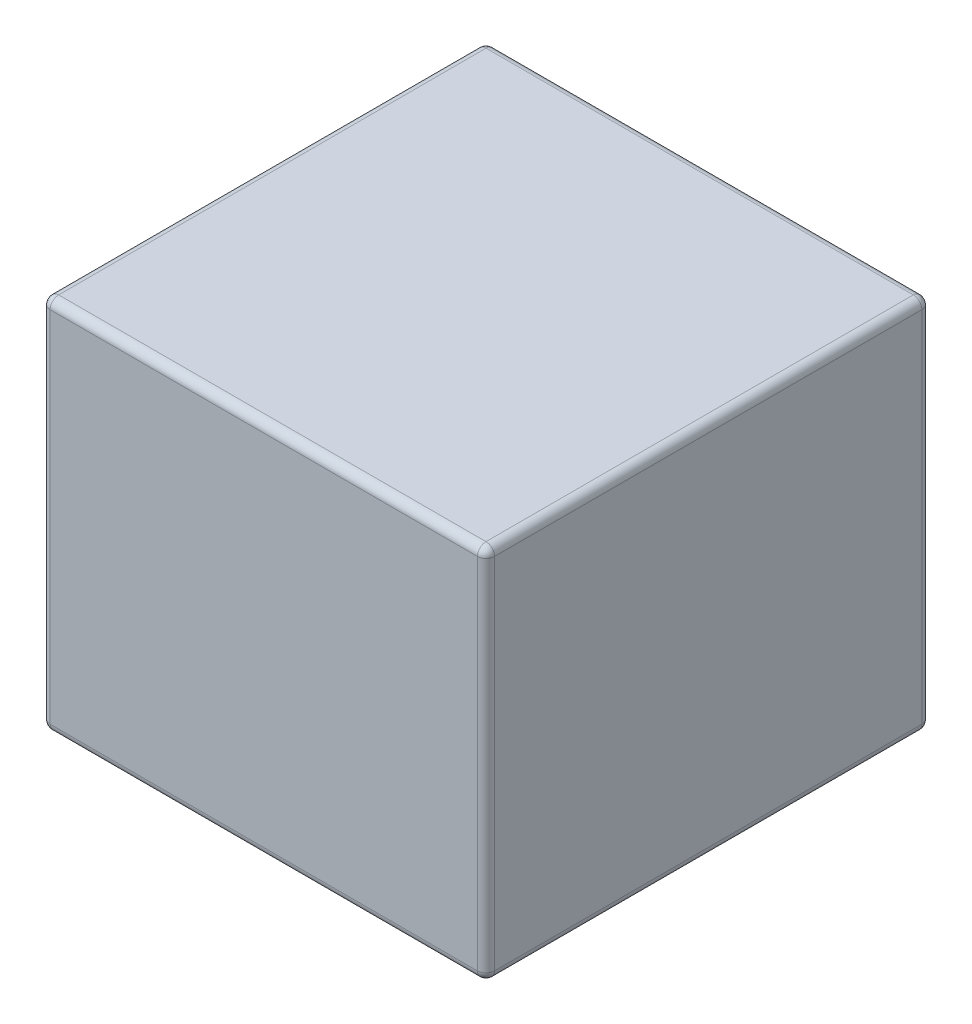
ISO-10303-21;
HEADER;
FILE_DESCRIPTION(('STEP AP214'),'2;1');
FILE_NAME('part.step','',(''),(''),'','','');
FILE_SCHEMA(('AUTOMOTIVE_DESIGN { 1 0 10303 214 1 1 1 1 }'));
ENDSEC;
DATA;
#1=APPLICATION_CONTEXT('core data for automotive mechanical design processes');
#2=APPLICATION_PROTOCOL_DEFINITION('international standard','automotive_design',2000,#1);
#3=PRODUCT_CONTEXT('',#1,'mechanical');
#4=PRODUCT('Part','Part','',(#3));
#5=PRODUCT_RELATED_PRODUCT_CATEGORY('part','',(#4));
#6=PRODUCT_DEFINITION_FORMATION('','',#4);
#7=PRODUCT_DEFINITION_CONTEXT('part definition',#1,'design');
#8=PRODUCT_DEFINITION('design','',#6,#7);
#9=PRODUCT_DEFINITION_SHAPE('','',#8);
#10=(LENGTH_UNIT() NAMED_UNIT(*) SI_UNIT(.MILLI.,.METRE.));
#11=(NAMED_UNIT(*) PLANE_ANGLE_UNIT() SI_UNIT($,.RADIAN.));
#12=(NAMED_UNIT(*) SI_UNIT($,.STERADIAN.) SOLID_ANGLE_UNIT());
#13=UNCERTAINTY_MEASURE_WITH_UNIT(LENGTH_MEASURE(1.E-05),#10,'distance_accuracy_value','');
#14=(GEOMETRIC_REPRESENTATION_CONTEXT(3) GLOBAL_UNCERTAINTY_ASSIGNED_CONTEXT((#13)) GLOBAL_UNIT_ASSIGNED_CONTEXT((#10,
#11,#12)) REPRESENTATION_CONTEXT('',''));
#15=CARTESIAN_POINT('',(0.,0.,0.));
#16=DIRECTION('',(0.,0.,1.));
#17=DIRECTION('',(1.,0.,0.));
#18=AXIS2_PLACEMENT_3D('',#15,#16,#17);
#19=CARTESIAN_POINT('',(165.1,279.4,165.1));
#20=DIRECTION('',(-1.,0.,0.));
#21=DIRECTION('',(0.,0.,1.));
#22=AXIS2_PLACEMENT_3D('',#19,#20,#21);
#23=PLANE('',#22);
#24=DIRECTION('',(0.,0.,-1.));
#25=VECTOR('',#24,1.);
#26=CARTESIAN_POINT('',(165.1,273.05,165.1));
#27=LINE('',#26,#25);
#28=CARTESIAN_POINT('',(165.1,273.05,-158.75));
#29=VERTEX_POINT('',#28);
#30=CARTESIAN_POINT('',(165.1,273.05,158.75));
#31=VERTEX_POINT('',#30);
#32=EDGE_CURVE('E153',#29,#31,#27,.F.);
#33=ORIENTED_EDGE('',*,*,#32,.T.);
#34=DIRECTION('',(0.,-1.,0.));
#35=VECTOR('',#34,1.);
#36=CARTESIAN_POINT('',(165.1,279.4,158.75));
#37=LINE('',#36,#35);
#38=CARTESIAN_POINT('',(165.1,6.35000000000002,158.75));
#39=VERTEX_POINT('',#38);
#40=EDGE_CURVE('E156',#31,#39,#37,.T.);
#41=ORIENTED_EDGE('',*,*,#40,.T.);
#42=DIRECTION('',(0.,0.,-1.));
#43=VECTOR('',#42,1.);
#44=CARTESIAN_POINT('',(165.1,6.35000000000002,-165.1));
#45=LINE('',#44,#43);
#46=CARTESIAN_POINT('',(165.1,6.35000000000002,-158.75));
#47=VERTEX_POINT('',#46);
#48=EDGE_CURVE('E130',#39,#47,#45,.T.);
#49=ORIENTED_EDGE('',*,*,#48,.T.);
#50=DIRECTION('',(0.,-1.,0.));
#51=VECTOR('',#50,1.);
#52=CARTESIAN_POINT('',(165.1,279.4,-158.75));
#53=LINE('',#52,#51);
#54=EDGE_CURVE('E148',#47,#29,#53,.F.);
#55=ORIENTED_EDGE('',*,*,#54,.T.);
#56=EDGE_LOOP('',(#33,#41,#49,#55));
#57=FACE_BOUND('',#56,.T.);
#58=ADVANCED_FACE('F33',(#57),#23,.F.);
#59=CARTESIAN_POINT('',(-165.1,279.4,-165.1));
#60=DIRECTION('',(0.,0.,1.));
#61=DIRECTION('',(1.,0.,0.));
#62=AXIS2_PLACEMENT_3D('',#59,#60,#61);
#63=PLANE('',#62);
#64=DIRECTION('',(-1.,0.,0.));
#65=VECTOR('',#64,1.);
#66=CARTESIAN_POINT('',(-165.1,6.35000000000002,-165.1));
#67=LINE('',#66,#65);
#68=CARTESIAN_POINT('',(158.75,6.35000000000002,-165.1));
#69=VERTEX_POINT('',#68);
#70=CARTESIAN_POINT('',(-158.75,6.35000000000002,-165.1));
#71=VERTEX_POINT('',#70);
#72=EDGE_CURVE('E173',#69,#71,#67,.T.);
#73=ORIENTED_EDGE('',*,*,#72,.T.);
#74=DIRECTION('',(0.,-1.,0.));
#75=VECTOR('',#74,1.);
#76=CARTESIAN_POINT('',(-158.75,279.4,-165.1));
#77=LINE('',#76,#75);
#78=CARTESIAN_POINT('',(-158.75,273.05,-165.1));
#79=VERTEX_POINT('',#78);
#80=EDGE_CURVE('E176',#71,#79,#77,.F.);
#81=ORIENTED_EDGE('',*,*,#80,.T.);
#82=DIRECTION('',(-1.,0.,0.));
#83=VECTOR('',#82,1.);
#84=CARTESIAN_POINT('',(-165.1,273.05,-165.1));
#85=LINE('',#84,#83);
#86=CARTESIAN_POINT('',(158.75,273.05,-165.1));
#87=VERTEX_POINT('',#86);
#88=EDGE_CURVE('E171',#79,#87,#85,.F.);
#89=ORIENTED_EDGE('',*,*,#88,.T.);
#90=DIRECTION('',(0.,-1.,0.));
#91=VECTOR('',#90,1.);
#92=CARTESIAN_POINT('',(158.75,279.4,-165.1));
#93=LINE('',#92,#91);
#94=EDGE_CURVE('E169',#87,#69,#93,.T.);
#95=ORIENTED_EDGE('',*,*,#94,.T.);
#96=EDGE_LOOP('',(#73,#81,#89,#95));
#97=FACE_BOUND('',#96,.T.);
#98=ADVANCED_FACE('F323',(#97),#63,.F.);
#99=CARTESIAN_POINT('',(-165.1,279.4,165.1));
#100=DIRECTION('',(1.,0.,0.));
#101=DIRECTION('',(0.,0.,-1.));
#102=AXIS2_PLACEMENT_3D('',#99,#100,#101);
#103=PLANE('',#102);
#104=DIRECTION('',(0.,0.,1.));
#105=VECTOR('',#104,1.);
#106=CARTESIAN_POINT('',(-165.1,6.35000000000002,165.1));
#107=LINE('',#106,#105);
#108=CARTESIAN_POINT('',(-165.1,6.35000000000002,-158.75));
#109=VERTEX_POINT('',#108);
#110=CARTESIAN_POINT('',(-165.1,6.35000000000002,158.75));
#111=VERTEX_POINT('',#110);
#112=EDGE_CURVE('E182',#109,#111,#107,.T.);
#113=ORIENTED_EDGE('',*,*,#112,.T.);
#114=DIRECTION('',(0.,-1.,0.));
#115=VECTOR('',#114,1.);
#116=CARTESIAN_POINT('',(-165.1,279.4,158.75));
#117=LINE('',#116,#115);
#118=CARTESIAN_POINT('',(-165.1,273.05,158.75));
#119=VERTEX_POINT('',#118);
#120=EDGE_CURVE('E185',#111,#119,#117,.F.);
#121=ORIENTED_EDGE('',*,*,#120,.T.);
#122=DIRECTION('',(0.,0.,1.));
#123=VECTOR('',#122,1.);
#124=CARTESIAN_POINT('',(-165.1,273.05,165.1));
#125=LINE('',#124,#123);
#126=CARTESIAN_POINT('',(-165.1,273.05,-158.75));
#127=VERTEX_POINT('',#126);
#128=EDGE_CURVE('E180',#119,#127,#125,.F.);
#129=ORIENTED_EDGE('',*,*,#128,.T.);
#130=DIRECTION('',(0.,-1.,0.));
#131=VECTOR('',#130,1.);
#132=CARTESIAN_POINT('',(-165.1,279.4,-158.75));
#133=LINE('',#132,#131);
#134=EDGE_CURVE('E178',#127,#109,#133,.T.);
#135=ORIENTED_EDGE('',*,*,#134,.T.);
#136=EDGE_LOOP('',(#113,#121,#129,#135));
#137=FACE_BOUND('',#136,.T.);
#138=ADVANCED_FACE('F293',(#137),#103,.F.);
#139=CARTESIAN_POINT('',(-165.1,279.4,165.1));
#140=DIRECTION('',(0.,0.,-1.));
#141=DIRECTION('',(-1.,0.,0.));
#142=AXIS2_PLACEMENT_3D('',#139,#140,#141);
#143=PLANE('',#142);
#144=DIRECTION('',(0.,-1.,0.));
#145=VECTOR('',#144,1.);
#146=CARTESIAN_POINT('',(-158.75,279.4,165.1));
#147=LINE('',#146,#145);
#148=CARTESIAN_POINT('',(-158.75,273.05,165.1));
#149=VERTEX_POINT('',#148);
#150=CARTESIAN_POINT('',(-158.75,6.35000000000002,165.1));
#151=VERTEX_POINT('',#150);
#152=EDGE_CURVE('E189',#149,#151,#147,.T.);
#153=ORIENTED_EDGE('',*,*,#152,.T.);
#154=DIRECTION('',(1.,0.,0.));
#155=VECTOR('',#154,1.);
#156=CARTESIAN_POINT('',(165.1,6.35000000000002,165.1));
#157=LINE('',#156,#155);
#158=CARTESIAN_POINT('',(158.75,6.35000000000002,165.1));
#159=VERTEX_POINT('',#158);
#160=EDGE_CURVE('E193',#151,#159,#157,.T.);
#161=ORIENTED_EDGE('',*,*,#160,.T.);
#162=DIRECTION('',(0.,-1.,0.));
#163=VECTOR('',#162,1.);
#164=CARTESIAN_POINT('',(158.75,279.4,165.1));
#165=LINE('',#164,#163);
#166=CARTESIAN_POINT('',(158.75,273.05,165.1));
#167=VERTEX_POINT('',#166);
#168=EDGE_CURVE('E191',#159,#167,#165,.F.);
#169=ORIENTED_EDGE('',*,*,#168,.T.);
#170=DIRECTION('',(1.,0.,0.));
#171=VECTOR('',#170,1.);
#172=CARTESIAN_POINT('',(-165.1,273.05,165.1));
#173=LINE('',#172,#171);
#174=EDGE_CURVE('E187',#167,#149,#173,.F.);
#175=ORIENTED_EDGE('',*,*,#174,.T.);
#176=EDGE_LOOP('',(#153,#161,#169,#175));
#177=FACE_BOUND('',#176,.T.);
#178=ADVANCED_FACE('F269',(#177),#143,.F.);
#179=CARTESIAN_POINT('',(0.,279.4,0.));
#180=DIRECTION('',(0.,-1.,0.));
#181=DIRECTION('',(0.,0.,-1.));
#182=AXIS2_PLACEMENT_3D('',#179,#180,#181);
#183=PLANE('',#182);
#184=DIRECTION('',(1.,0.,0.));
#185=VECTOR('',#184,1.);
#186=CARTESIAN_POINT('',(0.,279.4,158.75));
#187=LINE('',#186,#185);
#188=CARTESIAN_POINT('',(-158.75,279.4,158.75));
#189=VERTEX_POINT('',#188);
#190=CARTESIAN_POINT('',(158.75,279.4,158.75));
#191=VERTEX_POINT('',#190);
#192=EDGE_CURVE('E196',#189,#191,#187,.T.);
#193=ORIENTED_EDGE('',*,*,#192,.T.);
#194=DIRECTION('',(0.,0.,-1.));
#195=VECTOR('',#194,1.);
#196=CARTESIAN_POINT('',(158.75,279.4,0.));
#197=LINE('',#196,#195);
#198=CARTESIAN_POINT('',(158.75,279.4,-158.75));
#199=VERTEX_POINT('',#198);
#200=EDGE_CURVE('E11',#191,#199,#197,.T.);
#201=ORIENTED_EDGE('',*,*,#200,.T.);
#202=DIRECTION('',(-1.,0.,0.));
#203=VECTOR('',#202,1.);
#204=CARTESIAN_POINT('',(0.,279.4,-158.75));
#205=LINE('',#204,#203);
#206=CARTESIAN_POINT('',(-158.75,279.4,-158.75));
#207=VERTEX_POINT('',#206);
#208=EDGE_CURVE('E42',#199,#207,#205,.T.);
#209=ORIENTED_EDGE('',*,*,#208,.T.);
#210=DIRECTION('',(0.,0.,1.));
#211=VECTOR('',#210,1.);
#212=CARTESIAN_POINT('',(-158.75,279.4,0.));
#213=LINE('',#212,#211);
#214=EDGE_CURVE('E198',#207,#189,#213,.T.);
#215=ORIENTED_EDGE('',*,*,#214,.T.);
#216=EDGE_LOOP('',(#193,#201,#209,#215));
#217=FACE_BOUND('',#216,.T.);
#218=ADVANCED_FACE('F277',(#217),#183,.F.);
#219=CARTESIAN_POINT('',(0.,0.,0.));
#220=DIRECTION('',(0.,-1.,0.));
#221=DIRECTION('',(0.,0.,-1.));
#222=AXIS2_PLACEMENT_3D('',#219,#220,#221);
#223=PLANE('',#222);
#224=DIRECTION('',(-1.,0.,0.));
#225=VECTOR('',#224,1.);
#226=CARTESIAN_POINT('',(165.1,0.,-158.75));
#227=LINE('',#226,#225);
#228=CARTESIAN_POINT('',(-158.75,0.,-158.75));
#229=VERTEX_POINT('',#228);
#230=CARTESIAN_POINT('',(158.75,0.,-158.75));
#231=VERTEX_POINT('',#230);
#232=EDGE_CURVE('E166',#229,#231,#227,.F.);
#233=ORIENTED_EDGE('',*,*,#232,.T.);
#234=DIRECTION('',(0.,0.,-1.));
#235=VECTOR('',#234,1.);
#236=CARTESIAN_POINT('',(158.75,0.,165.1));
#237=LINE('',#236,#235);
#238=CARTESIAN_POINT('',(158.75,0.,158.75));
#239=VERTEX_POINT('',#238);
#240=EDGE_CURVE('E132',#231,#239,#237,.F.);
#241=ORIENTED_EDGE('',*,*,#240,.T.);
#242=DIRECTION('',(1.,0.,0.));
#243=VECTOR('',#242,1.);
#244=CARTESIAN_POINT('',(-165.1,0.,158.75));
#245=LINE('',#244,#243);
#246=CARTESIAN_POINT('',(-158.75,0.,158.75));
#247=VERTEX_POINT('',#246);
#248=EDGE_CURVE('E159',#239,#247,#245,.F.);
#249=ORIENTED_EDGE('',*,*,#248,.T.);
#250=DIRECTION('',(0.,0.,1.));
#251=VECTOR('',#250,1.);
#252=CARTESIAN_POINT('',(-158.75,0.,-165.1));
#253=LINE('',#252,#251);
#254=EDGE_CURVE('E164',#247,#229,#253,.F.);
#255=ORIENTED_EDGE('',*,*,#254,.T.);
#256=EDGE_LOOP('',(#233,#241,#249,#255));
#257=FACE_BOUND('',#256,.T.);
#258=ADVANCED_FACE('F356',(#257),#223,.T.);
#259=CARTESIAN_POINT('',(-158.75,273.05,0.));
#260=DIRECTION('',(0.,0.,1.));
#261=DIRECTION('',(1.,0.,0.));
#262=AXIS2_PLACEMENT_3D('',#259,#260,#261);
#263=CYLINDRICAL_SURFACE('',#262,6.35);
#264=CARTESIAN_POINT('',(-158.75,273.05,158.75));
#265=DIRECTION('',(0.,0.,1.));
#266=DIRECTION('',(1.,0.,0.));
#267=AXIS2_PLACEMENT_3D('',#264,#265,#266);
#268=CIRCLE('',#267,6.35);
#269=EDGE_CURVE('E37',#189,#119,#268,.T.);
#270=ORIENTED_EDGE('',*,*,#269,.F.);
#271=ORIENTED_EDGE('',*,*,#214,.F.);
#272=CARTESIAN_POINT('',(-158.75,273.05,-158.75));
#273=DIRECTION('',(0.,0.,-1.));
#274=DIRECTION('',(0.,1.,0.));
#275=AXIS2_PLACEMENT_3D('',#272,#273,#274);
#276=CIRCLE('',#275,6.35);
#277=EDGE_CURVE('E247',#127,#207,#276,.T.);
#278=ORIENTED_EDGE('',*,*,#277,.F.);
#279=ORIENTED_EDGE('',*,*,#128,.F.);
#280=EDGE_LOOP('',(#270,#271,#278,#279));
#281=FACE_BOUND('',#280,.T.);
#282=ADVANCED_FACE('F35',(#281),#263,.T.);
#283=CARTESIAN_POINT('',(-158.75,273.05,158.75));
#284=DIRECTION('',(0.,0.,1.));
#285=DIRECTION('',(1.,0.,0.));
#286=AXIS2_PLACEMENT_3D('',#283,#284,#285);
#287=SPHERICAL_SURFACE('',#286,6.35);
#288=CARTESIAN_POINT('',(-158.75,273.05,158.75));
#289=DIRECTION('',(-1.,0.,0.));
#290=DIRECTION('',(0.,0.,1.));
#291=AXIS2_PLACEMENT_3D('',#288,#289,#290);
#292=CIRCLE('',#291,6.35);
#293=EDGE_CURVE('E242',#189,#149,#292,.F.);
#294=ORIENTED_EDGE('',*,*,#293,.F.);
#295=ORIENTED_EDGE('',*,*,#269,.T.);
#296=CARTESIAN_POINT('',(-158.75,273.05,158.75));
#297=DIRECTION('',(0.,1.,0.));
#298=DIRECTION('',(0.,0.,1.));
#299=AXIS2_PLACEMENT_3D('',#296,#297,#298);
#300=CIRCLE('',#299,6.35);
#301=EDGE_CURVE('E245',#149,#119,#300,.F.);
#302=ORIENTED_EDGE('',*,*,#301,.F.);
#303=EDGE_LOOP('',(#294,#295,#302));
#304=FACE_BOUND('',#303,.T.);
#305=ADVANCED_FACE('F258',(#304),#287,.T.);
#306=CARTESIAN_POINT('',(-158.75,273.05,-158.75));
#307=DIRECTION('',(0.,0.,1.));
#308=DIRECTION('',(1.,0.,0.));
#309=AXIS2_PLACEMENT_3D('',#306,#307,#308);
#310=SPHERICAL_SURFACE('',#309,6.35);
#311=CARTESIAN_POINT('',(-158.75,273.05,-158.75));
#312=DIRECTION('',(0.,1.,0.));
#313=DIRECTION('',(0.,0.,1.));
#314=AXIS2_PLACEMENT_3D('',#311,#312,#313);
#315=CIRCLE('',#314,6.35);
#316=EDGE_CURVE('E236',#127,#79,#315,.F.);
#317=ORIENTED_EDGE('',*,*,#316,.F.);
#318=ORIENTED_EDGE('',*,*,#277,.T.);
#319=CARTESIAN_POINT('',(-158.75,273.05,-158.75));
#320=DIRECTION('',(-1.,0.,0.));
#321=DIRECTION('',(0.,0.,1.));
#322=AXIS2_PLACEMENT_3D('',#319,#320,#321);
#323=CIRCLE('',#322,6.35);
#324=EDGE_CURVE('E239',#79,#207,#323,.F.);
#325=ORIENTED_EDGE('',*,*,#324,.F.);
#326=EDGE_LOOP('',(#317,#318,#325));
#327=FACE_BOUND('',#326,.T.);
#328=ADVANCED_FACE('F285',(#327),#310,.T.);
#329=CARTESIAN_POINT('',(-158.75,279.4,158.75));
#330=DIRECTION('',(0.,-1.,0.));
#331=DIRECTION('',(0.,0.,-1.));
#332=AXIS2_PLACEMENT_3D('',#329,#330,#331);
#333=CYLINDRICAL_SURFACE('',#332,6.35);
#334=ORIENTED_EDGE('',*,*,#301,.T.);
#335=ORIENTED_EDGE('',*,*,#120,.F.);
#336=CARTESIAN_POINT('',(-158.75,6.35000000000002,158.75));
#337=DIRECTION('',(0.,-1.,0.));
#338=DIRECTION('',(0.,0.,-1.));
#339=AXIS2_PLACEMENT_3D('',#336,#337,#338);
#340=CIRCLE('',#339,6.35);
#341=EDGE_CURVE('E231',#151,#111,#340,.T.);
#342=ORIENTED_EDGE('',*,*,#341,.F.);
#343=ORIENTED_EDGE('',*,*,#152,.F.);
#344=EDGE_LOOP('',(#334,#335,#342,#343));
#345=FACE_BOUND('',#344,.T.);
#346=ADVANCED_FACE('F265',(#345),#333,.T.);
#347=CARTESIAN_POINT('',(0.,273.05,158.75));
#348=DIRECTION('',(1.,0.,0.));
#349=DIRECTION('',(0.,0.,-1.));
#350=AXIS2_PLACEMENT_3D('',#347,#348,#349);
#351=CYLINDRICAL_SURFACE('',#350,6.35);
#352=ORIENTED_EDGE('',*,*,#293,.T.);
#353=ORIENTED_EDGE('',*,*,#174,.F.);
#354=CARTESIAN_POINT('',(158.75,273.05,158.75));
#355=DIRECTION('',(1.,0.,0.));
#356=DIRECTION('',(0.,0.,-1.));
#357=AXIS2_PLACEMENT_3D('',#354,#355,#356);
#358=CIRCLE('',#357,6.35);
#359=EDGE_CURVE('E228',#191,#167,#358,.T.);
#360=ORIENTED_EDGE('',*,*,#359,.F.);
#361=ORIENTED_EDGE('',*,*,#192,.F.);
#362=EDGE_LOOP('',(#352,#353,#360,#361));
#363=FACE_BOUND('',#362,.T.);
#364=ADVANCED_FACE('F275',(#363),#351,.T.);
#365=CARTESIAN_POINT('',(158.75,273.05,0.));
#366=DIRECTION('',(0.,0.,-1.));
#367=DIRECTION('',(-1.,0.,0.));
#368=AXIS2_PLACEMENT_3D('',#365,#366,#367);
#369=CYLINDRICAL_SURFACE('',#368,6.35);
#370=CARTESIAN_POINT('',(158.75,273.05,-158.75));
#371=DIRECTION('',(0.,0.,-1.));
#372=DIRECTION('',(-1.,0.,0.));
#373=AXIS2_PLACEMENT_3D('',#370,#371,#372);
#374=CIRCLE('',#373,6.35);
#375=EDGE_CURVE('E223',#199,#29,#374,.T.);
#376=ORIENTED_EDGE('',*,*,#375,.F.);
#377=ORIENTED_EDGE('',*,*,#200,.F.);
#378=CARTESIAN_POINT('',(158.75,273.05,158.75));
#379=DIRECTION('',(0.,0.,1.));
#380=DIRECTION('',(1.,0.,0.));
#381=AXIS2_PLACEMENT_3D('',#378,#379,#380);
#382=CIRCLE('',#381,6.35);
#383=EDGE_CURVE('E225',#31,#191,#382,.T.);
#384=ORIENTED_EDGE('',*,*,#383,.F.);
#385=ORIENTED_EDGE('',*,*,#32,.F.);
#386=EDGE_LOOP('',(#376,#377,#384,#385));
#387=FACE_BOUND('',#386,.T.);
#388=ADVANCED_FACE('F280',(#387),#369,.T.);
#389=CARTESIAN_POINT('',(0.,273.05,-158.75));
#390=DIRECTION('',(-1.,0.,0.));
#391=DIRECTION('',(0.,0.,1.));
#392=AXIS2_PLACEMENT_3D('',#389,#390,#391);
#393=CYLINDRICAL_SURFACE('',#392,6.35);
#394=ORIENTED_EDGE('',*,*,#324,.T.);
#395=ORIENTED_EDGE('',*,*,#208,.F.);
#396=CARTESIAN_POINT('',(158.75,273.05,-158.75));
#397=DIRECTION('',(1.,0.,0.));
#398=DIRECTION('',(0.,1.,0.));
#399=AXIS2_PLACEMENT_3D('',#396,#397,#398);
#400=CIRCLE('',#399,6.35);
#401=EDGE_CURVE('E50',#87,#199,#400,.T.);
#402=ORIENTED_EDGE('',*,*,#401,.F.);
#403=ORIENTED_EDGE('',*,*,#88,.F.);
#404=EDGE_LOOP('',(#394,#395,#402,#403));
#405=FACE_BOUND('',#404,.T.);
#406=ADVANCED_FACE('F283',(#405),#393,.T.);
#407=CARTESIAN_POINT('',(-158.75,279.4,-158.75));
#408=DIRECTION('',(0.,-1.,0.));
#409=DIRECTION('',(0.,0.,-1.));
#410=AXIS2_PLACEMENT_3D('',#407,#408,#409);
#411=CYLINDRICAL_SURFACE('',#410,6.35);
#412=ORIENTED_EDGE('',*,*,#316,.T.);
#413=ORIENTED_EDGE('',*,*,#80,.F.);
#414=CARTESIAN_POINT('',(-158.75,6.35000000000002,-158.75));
#415=DIRECTION('',(0.,-1.,0.));
#416=DIRECTION('',(0.,0.,-1.));
#417=AXIS2_PLACEMENT_3D('',#414,#415,#416);
#418=CIRCLE('',#417,6.35);
#419=EDGE_CURVE('E219',#109,#71,#418,.T.);
#420=ORIENTED_EDGE('',*,*,#419,.F.);
#421=ORIENTED_EDGE('',*,*,#134,.F.);
#422=EDGE_LOOP('',(#412,#413,#420,#421));
#423=FACE_BOUND('',#422,.T.);
#424=ADVANCED_FACE('F290',(#423),#411,.T.);
#425=CARTESIAN_POINT('',(-158.75,6.35000000000002,165.1));
#426=DIRECTION('',(0.,0.,-1.));
#427=DIRECTION('',(-1.,0.,0.));
#428=AXIS2_PLACEMENT_3D('',#425,#426,#427);
#429=CYLINDRICAL_SURFACE('',#428,6.35);
#430=CARTESIAN_POINT('',(-158.75,6.35000000000002,158.75));
#431=DIRECTION('',(0.,0.,1.));
#432=DIRECTION('',(1.,0.,0.));
#433=AXIS2_PLACEMENT_3D('',#430,#431,#432);
#434=CIRCLE('',#433,6.35);
#435=EDGE_CURVE('E233',#111,#247,#434,.T.);
#436=ORIENTED_EDGE('',*,*,#435,.F.);
#437=ORIENTED_EDGE('',*,*,#112,.F.);
#438=CARTESIAN_POINT('',(-158.75,6.35,-158.75));
#439=DIRECTION('',(0.,0.,-1.));
#440=DIRECTION('',(-1.,0.,0.));
#441=AXIS2_PLACEMENT_3D('',#438,#439,#440);
#442=CIRCLE('',#441,6.35);
#443=EDGE_CURVE('E216',#229,#109,#442,.T.);
#444=ORIENTED_EDGE('',*,*,#443,.F.);
#445=ORIENTED_EDGE('',*,*,#254,.F.);
#446=EDGE_LOOP('',(#436,#437,#444,#445));
#447=FACE_BOUND('',#446,.T.);
#448=ADVANCED_FACE('F297',(#447),#429,.T.);
#449=CARTESIAN_POINT('',(-158.75,6.35,158.75));
#450=DIRECTION('',(0.,0.,1.));
#451=DIRECTION('',(1.,0.,0.));
#452=AXIS2_PLACEMENT_3D('',#449,#450,#451);
#453=SPHERICAL_SURFACE('',#452,6.35);
#454=ORIENTED_EDGE('',*,*,#341,.T.);
#455=ORIENTED_EDGE('',*,*,#435,.T.);
#456=CARTESIAN_POINT('',(-158.75,6.35,158.75));
#457=DIRECTION('',(-1.,0.,0.));
#458=DIRECTION('',(0.,0.,1.));
#459=AXIS2_PLACEMENT_3D('',#456,#457,#458);
#460=CIRCLE('',#459,6.35);
#461=EDGE_CURVE('E213',#151,#247,#460,.F.);
#462=ORIENTED_EDGE('',*,*,#461,.F.);
#463=EDGE_LOOP('',(#454,#455,#462));
#464=FACE_BOUND('',#463,.T.);
#465=ADVANCED_FACE('F301',(#464),#453,.T.);
#466=CARTESIAN_POINT('',(158.75,273.05,158.75));
#467=DIRECTION('',(0.,0.,1.));
#468=DIRECTION('',(1.,0.,0.));
#469=AXIS2_PLACEMENT_3D('',#466,#467,#468);
#470=SPHERICAL_SURFACE('',#469,6.35);
#471=ORIENTED_EDGE('',*,*,#383,.T.);
#472=ORIENTED_EDGE('',*,*,#359,.T.);
#473=CARTESIAN_POINT('',(158.75,273.05,158.75));
#474=DIRECTION('',(0.,1.,0.));
#475=DIRECTION('',(0.,0.,1.));
#476=AXIS2_PLACEMENT_3D('',#473,#474,#475);
#477=CIRCLE('',#476,6.35);
#478=EDGE_CURVE('E210',#31,#167,#477,.F.);
#479=ORIENTED_EDGE('',*,*,#478,.F.);
#480=EDGE_LOOP('',(#471,#472,#479));
#481=FACE_BOUND('',#480,.T.);
#482=ADVANCED_FACE('F311',(#481),#470,.T.);
#483=CARTESIAN_POINT('',(158.75,273.05,-158.75));
#484=DIRECTION('',(0.,0.,1.));
#485=DIRECTION('',(1.,0.,0.));
#486=AXIS2_PLACEMENT_3D('',#483,#484,#485);
#487=SPHERICAL_SURFACE('',#486,6.35);
#488=ORIENTED_EDGE('',*,*,#401,.T.);
#489=ORIENTED_EDGE('',*,*,#375,.T.);
#490=CARTESIAN_POINT('',(158.75,273.05,-158.75));
#491=DIRECTION('',(0.,1.,0.));
#492=DIRECTION('',(0.,0.,1.));
#493=AXIS2_PLACEMENT_3D('',#490,#491,#492);
#494=CIRCLE('',#493,6.35);
#495=EDGE_CURVE('E150',#87,#29,#494,.F.);
#496=ORIENTED_EDGE('',*,*,#495,.F.);
#497=EDGE_LOOP('',(#488,#489,#496));
#498=FACE_BOUND('',#497,.T.);
#499=ADVANCED_FACE('F313',(#498),#487,.T.);
#500=CARTESIAN_POINT('',(-158.75,6.35,-158.75));
#501=DIRECTION('',(0.,0.,1.));
#502=DIRECTION('',(1.,0.,0.));
#503=AXIS2_PLACEMENT_3D('',#500,#501,#502);
#504=SPHERICAL_SURFACE('',#503,6.35);
#505=ORIENTED_EDGE('',*,*,#443,.T.);
#506=ORIENTED_EDGE('',*,*,#419,.T.);
#507=CARTESIAN_POINT('',(-158.75,6.35000000000002,-158.75));
#508=DIRECTION('',(-1.,0.,0.));
#509=DIRECTION('',(0.,0.,1.));
#510=AXIS2_PLACEMENT_3D('',#507,#508,#509);
#511=CIRCLE('',#510,6.35);
#512=EDGE_CURVE('E207',#229,#71,#511,.F.);
#513=ORIENTED_EDGE('',*,*,#512,.F.);
#514=EDGE_LOOP('',(#505,#506,#513));
#515=FACE_BOUND('',#514,.T.);
#516=ADVANCED_FACE('F319',(#515),#504,.T.);
#517=CARTESIAN_POINT('',(-165.1,6.35000000000002,158.75));
#518=DIRECTION('',(-1.,0.,0.));
#519=DIRECTION('',(0.,0.,1.));
#520=AXIS2_PLACEMENT_3D('',#517,#518,#519);
#521=CYLINDRICAL_SURFACE('',#520,6.35);
#522=ORIENTED_EDGE('',*,*,#461,.T.);
#523=ORIENTED_EDGE('',*,*,#248,.F.);
#524=CARTESIAN_POINT('',(158.75,6.35000000000002,158.75));
#525=DIRECTION('',(1.,0.,0.));
#526=DIRECTION('',(0.,0.,-1.));
#527=AXIS2_PLACEMENT_3D('',#524,#525,#526);
#528=CIRCLE('',#527,6.35);
#529=EDGE_CURVE('E204',#159,#239,#528,.T.);
#530=ORIENTED_EDGE('',*,*,#529,.F.);
#531=ORIENTED_EDGE('',*,*,#160,.F.);
#532=EDGE_LOOP('',(#522,#523,#530,#531));
#533=FACE_BOUND('',#532,.T.);
#534=ADVANCED_FACE('F304',(#533),#521,.T.);
#535=CARTESIAN_POINT('',(158.75,279.4,158.75));
#536=DIRECTION('',(0.,-1.,0.));
#537=DIRECTION('',(0.,0.,-1.));
#538=AXIS2_PLACEMENT_3D('',#535,#536,#537);
#539=CYLINDRICAL_SURFACE('',#538,6.35);
#540=ORIENTED_EDGE('',*,*,#478,.T.);
#541=ORIENTED_EDGE('',*,*,#168,.F.);
#542=CARTESIAN_POINT('',(158.75,6.35000000000002,158.75));
#543=DIRECTION('',(0.,-1.,0.));
#544=DIRECTION('',(0.,0.,-1.));
#545=AXIS2_PLACEMENT_3D('',#542,#543,#544);
#546=CIRCLE('',#545,6.35);
#547=EDGE_CURVE('E145',#39,#159,#546,.T.);
#548=ORIENTED_EDGE('',*,*,#547,.F.);
#549=ORIENTED_EDGE('',*,*,#40,.F.);
#550=EDGE_LOOP('',(#540,#541,#548,#549));
#551=FACE_BOUND('',#550,.T.);
#552=ADVANCED_FACE('F309',(#551),#539,.T.);
#553=CARTESIAN_POINT('',(158.75,279.4,-158.75));
#554=DIRECTION('',(0.,-1.,0.));
#555=DIRECTION('',(0.,0.,-1.));
#556=AXIS2_PLACEMENT_3D('',#553,#554,#555);
#557=CYLINDRICAL_SURFACE('',#556,6.35);
#558=ORIENTED_EDGE('',*,*,#495,.T.);
#559=ORIENTED_EDGE('',*,*,#54,.F.);
#560=CARTESIAN_POINT('',(158.75,6.35000000000002,-158.75));
#561=DIRECTION('',(0.,-1.,0.));
#562=DIRECTION('',(0.,0.,-1.));
#563=AXIS2_PLACEMENT_3D('',#560,#561,#562);
#564=CIRCLE('',#563,6.35);
#565=EDGE_CURVE('E138',#69,#47,#564,.T.);
#566=ORIENTED_EDGE('',*,*,#565,.F.);
#567=ORIENTED_EDGE('',*,*,#94,.F.);
#568=EDGE_LOOP('',(#558,#559,#566,#567));
#569=FACE_BOUND('',#568,.T.);
#570=ADVANCED_FACE('F149',(#569),#557,.T.);
#571=CARTESIAN_POINT('',(-165.1,6.35000000000002,-158.75));
#572=DIRECTION('',(1.,0.,0.));
#573=DIRECTION('',(0.,0.,-1.));
#574=AXIS2_PLACEMENT_3D('',#571,#572,#573);
#575=CYLINDRICAL_SURFACE('',#574,6.35);
#576=ORIENTED_EDGE('',*,*,#512,.T.);
#577=ORIENTED_EDGE('',*,*,#72,.F.);
#578=CARTESIAN_POINT('',(158.75,6.35,-158.75));
#579=DIRECTION('',(1.,0.,0.));
#580=DIRECTION('',(0.,0.,-1.));
#581=AXIS2_PLACEMENT_3D('',#578,#579,#580);
#582=CIRCLE('',#581,6.35);
#583=EDGE_CURVE('E142',#231,#69,#582,.T.);
#584=ORIENTED_EDGE('',*,*,#583,.F.);
#585=ORIENTED_EDGE('',*,*,#232,.F.);
#586=EDGE_LOOP('',(#576,#577,#584,#585));
#587=FACE_BOUND('',#586,.T.);
#588=ADVANCED_FACE('F339',(#587),#575,.T.);
#589=CARTESIAN_POINT('',(158.75,6.35,158.75));
#590=DIRECTION('',(0.,0.,1.));
#591=DIRECTION('',(1.,0.,0.));
#592=AXIS2_PLACEMENT_3D('',#589,#590,#591);
#593=SPHERICAL_SURFACE('',#592,6.35);
#594=ORIENTED_EDGE('',*,*,#547,.T.);
#595=ORIENTED_EDGE('',*,*,#529,.T.);
#596=CARTESIAN_POINT('',(158.75,6.35,158.75));
#597=DIRECTION('',(0.,0.,1.));
#598=DIRECTION('',(1.,0.,0.));
#599=AXIS2_PLACEMENT_3D('',#596,#597,#598);
#600=CIRCLE('',#599,6.35);
#601=EDGE_CURVE('E135',#39,#239,#600,.F.);
#602=ORIENTED_EDGE('',*,*,#601,.F.);
#603=EDGE_LOOP('',(#594,#595,#602));
#604=FACE_BOUND('',#603,.T.);
#605=ADVANCED_FACE('F336',(#604),#593,.T.);
#606=CARTESIAN_POINT('',(158.75,6.35,-158.75));
#607=DIRECTION('',(0.,0.,1.));
#608=DIRECTION('',(1.,0.,0.));
#609=AXIS2_PLACEMENT_3D('',#606,#607,#608);
#610=SPHERICAL_SURFACE('',#609,6.35);
#611=ORIENTED_EDGE('',*,*,#583,.T.);
#612=ORIENTED_EDGE('',*,*,#565,.T.);
#613=CARTESIAN_POINT('',(158.75,6.35000000000002,-158.75));
#614=DIRECTION('',(0.,0.,-1.));
#615=DIRECTION('',(-1.,0.,0.));
#616=AXIS2_PLACEMENT_3D('',#613,#614,#615);
#617=CIRCLE('',#616,6.35);
#618=EDGE_CURVE('E126',#231,#47,#617,.F.);
#619=ORIENTED_EDGE('',*,*,#618,.F.);
#620=EDGE_LOOP('',(#611,#612,#619));
#621=FACE_BOUND('',#620,.T.);
#622=ADVANCED_FACE('F140',(#621),#610,.T.);
#623=CARTESIAN_POINT('',(158.75,6.35000000000002,165.1));
#624=DIRECTION('',(0.,0.,1.));
#625=DIRECTION('',(1.,0.,0.));
#626=AXIS2_PLACEMENT_3D('',#623,#624,#625);
#627=CYLINDRICAL_SURFACE('',#626,6.35);
#628=ORIENTED_EDGE('',*,*,#601,.T.);
#629=ORIENTED_EDGE('',*,*,#240,.F.);
#630=ORIENTED_EDGE('',*,*,#618,.T.);
#631=ORIENTED_EDGE('',*,*,#48,.F.);
#632=EDGE_LOOP('',(#628,#629,#630,#631));
#633=FACE_BOUND('',#632,.T.);
#634=ADVANCED_FACE('F128',(#633),#627,.T.);
#635=CLOSED_SHELL('',(#58,#98,#138,#178,#218,#258,#282,#305,#328,#346,#364,#388,#406,#424,#448,
#465,#482,#499,#516,#534,#552,#570,#588,#605,#622,#634));
#636=MANIFOLD_SOLID_BREP('B2',#635);
#637=ADVANCED_BREP_SHAPE_REPRESENTATION('',(#18,#636),#14);
#638=SHAPE_DEFINITION_REPRESENTATION(#9,#637);
ENDSEC;
END-ISO-10303-21;
